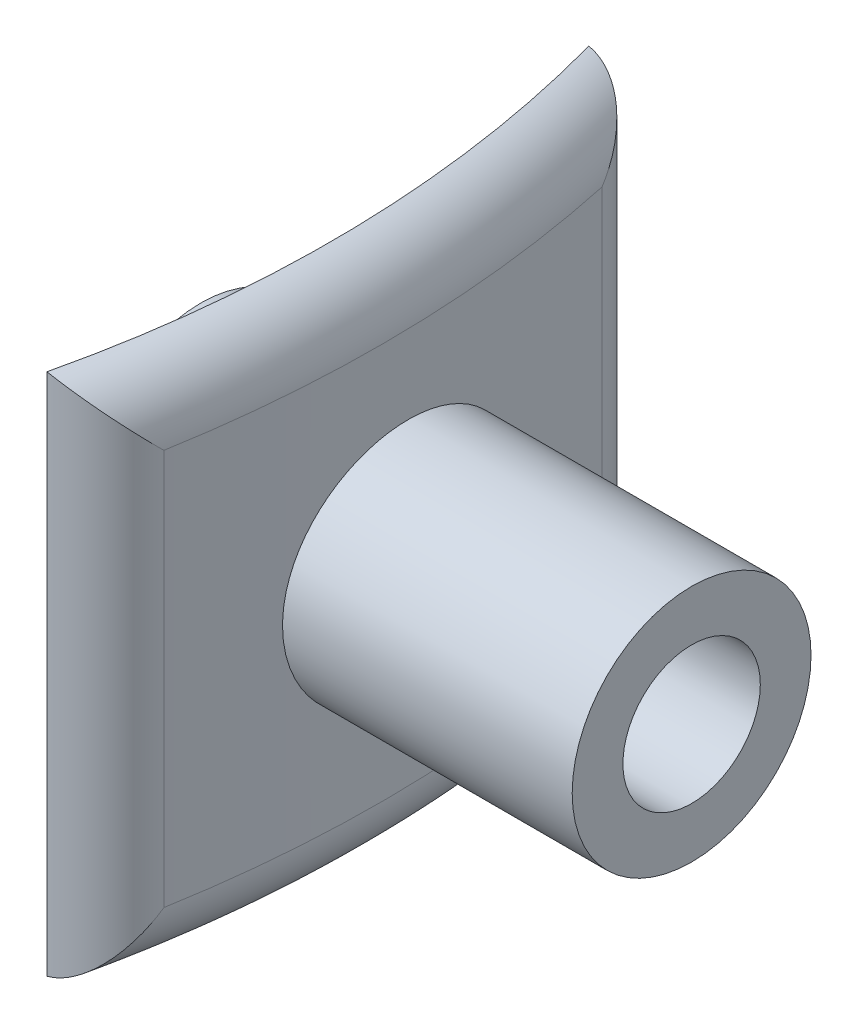
ISO-10303-21;
HEADER;
FILE_DESCRIPTION(('STEP AP214'),'2;1');
FILE_NAME('part.step','',(''),(''),'','','');
FILE_SCHEMA(('AUTOMOTIVE_DESIGN { 1 0 10303 214 1 1 1 1 }'));
ENDSEC;
DATA;
#1=APPLICATION_CONTEXT('core data for automotive mechanical design processes');
#2=APPLICATION_PROTOCOL_DEFINITION('international standard','automotive_design',2000,#1);
#3=PRODUCT_CONTEXT('',#1,'mechanical');
#4=PRODUCT('Part','Part','',(#3));
#5=PRODUCT_RELATED_PRODUCT_CATEGORY('part','',(#4));
#6=PRODUCT_DEFINITION_FORMATION('','',#4);
#7=PRODUCT_DEFINITION_CONTEXT('part definition',#1,'design');
#8=PRODUCT_DEFINITION('design','',#6,#7);
#9=PRODUCT_DEFINITION_SHAPE('','',#8);
#10=(LENGTH_UNIT() NAMED_UNIT(*) SI_UNIT(.MILLI.,.METRE.));
#11=(NAMED_UNIT(*) PLANE_ANGLE_UNIT() SI_UNIT($,.RADIAN.));
#12=(NAMED_UNIT(*) SI_UNIT($,.STERADIAN.) SOLID_ANGLE_UNIT());
#13=UNCERTAINTY_MEASURE_WITH_UNIT(LENGTH_MEASURE(1.E-05),#10,'distance_accuracy_value','');
#14=(GEOMETRIC_REPRESENTATION_CONTEXT(3) GLOBAL_UNCERTAINTY_ASSIGNED_CONTEXT((#13)) GLOBAL_UNIT_ASSIGNED_CONTEXT((#10,
#11,#12)) REPRESENTATION_CONTEXT('',''));
#15=CARTESIAN_POINT('',(0.,0.,0.));
#16=DIRECTION('',(0.,0.,1.));
#17=DIRECTION('',(1.,0.,0.));
#18=AXIS2_PLACEMENT_3D('',#15,#16,#17);
#19=CARTESIAN_POINT('',(15.,0.,0.));
#20=DIRECTION('',(-1.,0.,0.));
#21=DIRECTION('',(0.,0.,1.));
#22=AXIS2_PLACEMENT_3D('',#19,#20,#21);
#23=CYLINDRICAL_SURFACE('',#22,3.65);
#24=CARTESIAN_POINT('',(0.,0.,0.));
#25=DIRECTION('',(1.,0.,0.));
#26=DIRECTION('',(0.,0.,-1.));
#27=AXIS2_PLACEMENT_3D('',#24,#25,#26);
#28=CIRCLE('',#27,3.65);
#29=CARTESIAN_POINT('',(0.,0.,-3.65));
#30=VERTEX_POINT('',#29);
#31=EDGE_CURVE('E161',#30,#30,#28,.T.);
#32=ORIENTED_EDGE('',*,*,#31,.T.);
#33=EDGE_LOOP('',(#32));
#34=FACE_BOUND('',#33,.T.);
#35=CARTESIAN_POINT('',(4.59120938322113,0.,3.65));
#36=CARTESIAN_POINT('',(4.59121172629048,-0.204664380028481,3.64999123078396));
#37=CARTESIAN_POINT('',(4.5926946806854,-0.409462104009955,3.63272860399176));
#38=CARTESIAN_POINT('',(4.59843485429364,-0.813382434525636,3.56412149706426));
#39=CARTESIAN_POINT('',(4.60269508906102,-1.01249862651295,3.51273996970616));
#40=CARTESIAN_POINT('',(4.61340902352784,-1.39915643436182,3.37739209715057));
#41=CARTESIAN_POINT('',(4.61986149177989,-1.58670447868848,3.29344404186284));
#42=CARTESIAN_POINT('',(4.63407833708024,-1.94501187111909,3.0953727205034));
#43=CARTESIAN_POINT('',(4.64184245187802,-2.11577456450987,2.98125548388415));
#44=CARTESIAN_POINT('',(4.65762357333344,-2.43616980114959,2.72574046192228));
#45=CARTESIAN_POINT('',(4.66564114732939,-2.58575012678884,2.5842772254321));
#46=CARTESIAN_POINT('',(4.68075193080286,-2.85907481830356,2.2782202108013));
#47=CARTESIAN_POINT('',(4.68784510711642,-2.98281825734362,2.1136256032333));
#48=CARTESIAN_POINT('',(4.70001266801859,-3.20101470616913,1.76583439696652));
#49=CARTESIAN_POINT('',(4.70508580794946,-3.2954496494678,1.58262641650373));
#50=CARTESIAN_POINT('',(4.71229938291332,-3.45220556214434,1.20289851524057));
#51=CARTESIAN_POINT('',(4.71443990637158,-3.5145274997693,1.00637899600182));
#52=CARTESIAN_POINT('',(4.71518524814789,-3.60508014639456,0.606440773291657));
#53=CARTESIAN_POINT('',(4.71380388848524,-3.63344348709828,0.40305212230182));
#54=CARTESIAN_POINT('',(4.70732044111687,-3.65572551651576,-0.0055408183184171));
#55=CARTESIAN_POINT('',(4.70221842456607,-3.64964486393146,-0.210745073152542));
#56=CARTESIAN_POINT('',(4.6885100656863,-3.60331405803135,-0.616652708301793));
#57=CARTESIAN_POINT('',(4.67991184105896,-3.56314282493557,-0.817365386098598));
#58=CARTESIAN_POINT('',(4.65980671754418,-3.44993511441104,-1.20914338931598));
#59=CARTESIAN_POINT('',(4.64829973968489,-3.37689774463372,-1.40020845263748));
#60=CARTESIAN_POINT('',(4.62325810221284,-3.19970549882439,-1.7681176739334));
#61=CARTESIAN_POINT('',(4.60971552845204,-3.09542751802431,-1.94490199267523));
#62=CARTESIAN_POINT('',(4.5818233749475,-2.85880485889646,-2.27849910145298));
#63=CARTESIAN_POINT('',(4.56747376429497,-2.72645910505952,-2.43531112581603));
#64=CARTESIAN_POINT('',(4.53920512197293,-2.4365950450517,-2.72539357663352));
#65=CARTESIAN_POINT('',(4.52528881869855,-2.27894528173508,-2.85853295972748));
#66=CARTESIAN_POINT('',(4.49929771877884,-1.94339164390809,-3.09645410040767));
#67=CARTESIAN_POINT('',(4.48722290875944,-1.76548791651097,-3.20123606394735));
#68=CARTESIAN_POINT('',(4.46611464212508,-1.39469527216041,-3.37928384768045));
#69=CARTESIAN_POINT('',(4.45707683602681,-1.20182827686854,-3.45259478165134));
#70=CARTESIAN_POINT('',(4.44292329907215,-0.806378047585215,-3.56574600224665));
#71=CARTESIAN_POINT('',(4.43780737097099,-0.603795302776908,-3.60558797215041));
#72=CARTESIAN_POINT('',(4.43203736195369,-0.196237655974126,-3.65044051904934));
#73=CARTESIAN_POINT('',(4.43135119813201,0.00870925047162435,-3.65570155614416));
#74=CARTESIAN_POINT('',(4.43442422376938,0.416562474339463,-3.63190051587832));
#75=CARTESIAN_POINT('',(4.43818331553003,0.619468836510047,-3.60283919285885));
#76=CARTESIAN_POINT('',(4.44975023311266,1.01681306795526,-3.51141283703367));
#77=CARTESIAN_POINT('',(4.45754492153211,1.21127621006062,-3.44915584921803));
#78=CARTESIAN_POINT('',(4.47640751990414,1.586996531997,-3.29322278604816));
#79=CARTESIAN_POINT('',(4.48747553613304,1.76825328281314,-3.19954569055263));
#80=CARTESIAN_POINT('',(4.51188066560152,2.11347054513811,-2.98286656360472));
#81=CARTESIAN_POINT('',(4.52522946480916,2.27733455710994,-2.85971212775771));
#82=CARTESIAN_POINT('',(4.55288536751527,2.58214548453924,-2.58780599751019));
#83=CARTESIAN_POINT('',(4.56719251156143,2.72309142946436,-2.43905321962206));
#84=CARTESIAN_POINT('',(4.59553525278712,2.97900005357171,-2.11903348802856));
#85=CARTESIAN_POINT('',(4.60956848813616,3.09378835493904,-1.94762682360452));
#86=CARTESIAN_POINT('',(4.63600299303269,3.29294703787098,-1.58785207213984));
#87=CARTESIAN_POINT('',(4.64840427220547,3.3773175988447,-1.39948408514822));
#88=CARTESIAN_POINT('',(4.67051402493837,3.51313841685286,-1.01124524967025));
#89=CARTESIAN_POINT('',(4.6802246326249,3.56461480672504,-0.81138367023917));
#90=CARTESIAN_POINT('',(4.69623438772658,3.63320893317534,-0.405716740416642));
#91=CARTESIAN_POINT('',(4.70253366115882,3.65032793900269,-0.199911609880038));
#92=CARTESIAN_POINT('',(4.71135807936394,3.64966447726444,0.210503328504181));
#93=CARTESIAN_POINT('',(4.7139053129971,3.6320877149395,0.41511301106181));
#94=CARTESIAN_POINT('',(4.71538185085023,3.5629223545254,0.818511769949876));
#95=CARTESIAN_POINT('',(4.71431119907785,3.51133417015444,1.01730091705115));
#96=CARTESIAN_POINT('',(4.70903979486041,3.37578405633285,1.40294757181104));
#97=CARTESIAN_POINT('',(4.70484630747234,3.29189748522415,1.58983168199341));
#98=CARTESIAN_POINT('',(4.69414344481571,3.09413631055805,1.94691433081452));
#99=CARTESIAN_POINT('',(4.68763409514057,2.98026203840917,2.11711305382298));
#100=CARTESIAN_POINT('',(4.67330622621298,2.72529975171006,2.43662883169474));
#101=CARTESIAN_POINT('',(4.6654833027046,2.58411993470346,2.58587242768518));
#102=CARTESIAN_POINT('',(4.64968879071726,2.27872673947672,2.85864061053118));
#103=CARTESIAN_POINT('',(4.64171716690657,2.11450782505275,2.98215899794423));
#104=CARTESIAN_POINT('',(4.62671992365287,1.76708067780975,3.20033817619805));
#105=CARTESIAN_POINT('',(4.61969768561444,1.58380847977612,3.29489726129375));
#106=CARTESIAN_POINT('',(4.60761041356423,1.20405491581571,3.45179213684502));
#107=CARTESIAN_POINT('',(4.60254322657721,1.00758836166003,3.51416339944199));
#108=CARTESIAN_POINT('',(4.59631408781219,0.675041302907358,3.58960707035691));
#109=CARTESIAN_POINT('',(4.59441062602691,0.541062092954273,3.61222344730068));
#110=CARTESIAN_POINT('',(4.59185749869404,0.271408134935148,3.6424227969206));
#111=CARTESIAN_POINT('',(4.59120782929782,0.135733392074987,3.65000581574302));
#112=CARTESIAN_POINT('',(4.59120938322113,0.,3.65));
#113=B_SPLINE_CURVE_WITH_KNOTS('',3,(#35,#36,#37,#38,#39,#40,#41,#42,#43,#44,#45,#46,#47,#48,
#49,#50,#51,#52,#53,#54,#55,#56,#57,#58,#59,#60,#61,#62,#63,#64,#65,#66,#67,#68,#69,#70,#71,#72,
#73,#74,#75,#76,#77,#78,#79,#80,#81,#82,#83,#84,#85,#86,#87,#88,#89,#90,#91,#92,#93,#94,#95,#96,
#97,#98,#99,#100,#101,#102,#103,#104,#105,#106,#107,#108,#109,#110,#111,#112),.UNSPECIFIED.,.T.,
.F.,(4,2,2,2,2,2,2,2,2,2,2,2,2,2,2,2,2,2,2,2,2,2,2,2,2,2,2,2,2,2,2,2,2,2,2,2,2,2,4),(0.,
0.6134981531781,1.22766355088713,1.84148452116802,2.45518290906428,3.07036875546838,
3.68557666637667,4.30116305698177,4.91673088580478,5.52988657261133,6.14303053355713,
6.75475891679047,7.36650391006527,7.98069194323136,8.59490351528817,9.21241591149892,
9.82992382273763,10.4465435551036,11.0631322735007,11.6752502431684,12.2873547598802,
12.8974790571522,13.5076231657264,14.1209927176272,14.7343882376882,15.3517604989498,
15.969129118783,16.5860066571413,17.2028614060536,17.8160699128898,18.4292709607365,
19.0410498788135,19.6528220361113,20.2666879208997,20.8807015686897,21.4968475508839,
22.1123130601382,22.5191862100421,22.92605811101),.UNSPECIFIED.);
#114=CARTESIAN_POINT('',(4.59120938322113,0.,3.65));
#115=VERTEX_POINT('',#114);
#116=EDGE_CURVE('E128',#115,#115,#113,.T.);
#117=ORIENTED_EDGE('',*,*,#116,.F.);
#118=EDGE_LOOP('',(#117));
#119=FACE_BOUND('',#118,.T.);
#120=ADVANCED_FACE('F47',(#34,#119),#23,.T.);
#121=CARTESIAN_POINT('',(0.,0.,0.));
#122=DIRECTION('',(1.,0.,0.));
#123=DIRECTION('',(0.,0.,-1.));
#124=AXIS2_PLACEMENT_3D('',#121,#122,#123);
#125=PLANE('',#124);
#126=ORIENTED_EDGE('',*,*,#31,.F.);
#127=EDGE_LOOP('',(#126));
#128=FACE_BOUND('',#127,.T.);
#129=CARTESIAN_POINT('',(0.,0.,0.));
#130=DIRECTION('',(1.,0.,0.));
#131=DIRECTION('',(0.,0.,-1.));
#132=AXIS2_PLACEMENT_3D('',#129,#130,#131);
#133=CIRCLE('',#132,2.1);
#134=CARTESIAN_POINT('',(0.,0.,-2.1));
#135=VERTEX_POINT('',#134);
#136=EDGE_CURVE('E127',#135,#135,#133,.T.);
#137=ORIENTED_EDGE('',*,*,#136,.T.);
#138=EDGE_LOOP('',(#137));
#139=FACE_BOUND('',#138,.T.);
#140=ADVANCED_FACE('F144',(#128,#139),#125,.F.);
#141=CARTESIAN_POINT('',(-29.5351271222658,-8.,0.742138807599469));
#142=DIRECTION('',(0.,1.,0.));
#143=DIRECTION('',(0.,0.,1.));
#144=AXIS2_PLACEMENT_3D('',#141,#142,#143);
#145=CYLINDRICAL_SURFACE('',#144,34.25);
#146=DIRECTION('',(0.,1.,0.));
#147=VECTOR('',#146,1.);
#148=CARTESIAN_POINT('',(3.81946698227984,-8.,8.52246991372905));
#149=LINE('',#148,#147);
#150=CARTESIAN_POINT('',(3.81946698227984,-8.,8.52246991372905));
#151=VERTEX_POINT('',#150);
#152=CARTESIAN_POINT('',(3.81946698227984,8.,8.52246991372905));
#153=VERTEX_POINT('',#152);
#154=EDGE_CURVE('E108',#151,#153,#149,.T.);
#155=ORIENTED_EDGE('',*,*,#154,.T.);
#156=CARTESIAN_POINT('',(-29.5351271222658,8.,0.742138807599469));
#157=DIRECTION('',(0.,1.,0.));
#158=DIRECTION('',(0.,0.,1.));
#159=AXIS2_PLACEMENT_3D('',#156,#157,#158);
#160=CIRCLE('',#159,34.25);
#161=CARTESIAN_POINT('',(3.47750715547917,8.,-8.38082551568144));
#162=VERTEX_POINT('',#161);
#163=EDGE_CURVE('E97',#153,#162,#160,.T.);
#164=ORIENTED_EDGE('',*,*,#163,.T.);
#165=DIRECTION('',(0.,1.,0.));
#166=VECTOR('',#165,1.);
#167=CARTESIAN_POINT('',(3.47750715547917,-8.,-8.38082551568144));
#168=LINE('',#167,#166);
#169=CARTESIAN_POINT('',(3.47750715547917,-8.,-8.38082551568144));
#170=VERTEX_POINT('',#169);
#171=EDGE_CURVE('E102',#170,#162,#168,.T.);
#172=ORIENTED_EDGE('',*,*,#171,.F.);
#173=CARTESIAN_POINT('',(-29.5351271222658,-8.,0.742138807599469));
#174=DIRECTION('',(0.,1.,0.));
#175=DIRECTION('',(0.,0.,1.));
#176=AXIS2_PLACEMENT_3D('',#173,#174,#175);
#177=CIRCLE('',#176,34.25);
#178=EDGE_CURVE('E114',#151,#170,#177,.T.);
#179=ORIENTED_EDGE('',*,*,#178,.F.);
#180=EDGE_LOOP('',(#155,#164,#172,#179));
#181=FACE_BOUND('',#180,.T.);
#182=ORIENTED_EDGE('',*,*,#116,.T.);
#183=EDGE_LOOP('',(#182));
#184=FACE_BOUND('',#183,.T.);
#185=ADVANCED_FACE('F110',(#181,#184),#145,.F.);
#186=CARTESIAN_POINT('',(-29.5351271222658,-8.,0.742138807599469));
#187=DIRECTION('',(0.,1.,0.));
#188=DIRECTION('',(0.,0.,1.));
#189=AXIS2_PLACEMENT_3D('',#186,#187,#188);
#190=CYLINDRICAL_SURFACE('',#189,35.8);
#191=DIRECTION('',(0.,1.,0.));
#192=VECTOR('',#191,1.);
#193=CARTESIAN_POINT('',(5.46084710193839,-8.,-6.80251413994131));
#194=LINE('',#193,#192);
#195=CARTESIAN_POINT('',(5.46084710193838,-6.05128247300949,-6.80251413994131));
#196=VERTEX_POINT('',#195);
#197=CARTESIAN_POINT('',(5.46084710193838,6.05128247300949,-6.80251413994131));
#198=VERTEX_POINT('',#197);
#199=EDGE_CURVE('E61',#196,#198,#194,.T.);
#200=ORIENTED_EDGE('',*,*,#199,.T.);
#201=CARTESIAN_POINT('',(-29.5351271222658,6.05128247300949,0.742138807599469));
#202=DIRECTION('',(0.,1.,0.));
#203=DIRECTION('',(0.,0.,1.));
#204=AXIS2_PLACEMENT_3D('',#201,#202,#203);
#205=CIRCLE('',#204,35.8);
#206=CARTESIAN_POINT('',(5.73735065546689,6.05128247300949,6.86523536239528));
#207=VERTEX_POINT('',#206);
#208=EDGE_CURVE('E12',#198,#207,#205,.F.);
#209=ORIENTED_EDGE('',*,*,#208,.T.);
#210=DIRECTION('',(0.,1.,0.));
#211=VECTOR('',#210,1.);
#212=CARTESIAN_POINT('',(5.7373506554669,-8.,6.86523536239528));
#213=LINE('',#212,#211);
#214=CARTESIAN_POINT('',(5.73735065546689,-6.05128247300949,6.86523536239528));
#215=VERTEX_POINT('',#214);
#216=EDGE_CURVE('E173',#207,#215,#213,.F.);
#217=ORIENTED_EDGE('',*,*,#216,.T.);
#218=CARTESIAN_POINT('',(-29.5351271222658,-6.05128247300949,0.742138807599469));
#219=DIRECTION('',(0.,-1.,0.));
#220=DIRECTION('',(0.,0.,-1.));
#221=AXIS2_PLACEMENT_3D('',#218,#219,#220);
#222=CIRCLE('',#221,35.8);
#223=EDGE_CURVE('E72',#215,#196,#222,.F.);
#224=ORIENTED_EDGE('',*,*,#223,.T.);
#225=EDGE_LOOP('',(#200,#209,#217,#224));
#226=FACE_BOUND('',#225,.T.);
#227=CARTESIAN_POINT('',(6.14658168330754,0.,3.65));
#228=CARTESIAN_POINT('',(6.14658393345488,-0.204694711462544,3.64999119865676));
#229=CARTESIAN_POINT('',(6.14800265794003,-0.409524065059438,3.6327234484694));
#230=CARTESIAN_POINT('',(6.15349439275443,-0.813509743745228,3.56409449054305));
#231=CARTESIAN_POINT('',(6.15757031446479,-1.01265959594112,3.51269588588899));
#232=CARTESIAN_POINT('',(6.16782104829782,-1.39938494321323,3.37729984504055));
#233=CARTESIAN_POINT('',(6.17399469694865,-1.5869667863144,3.2933204756112));
#234=CARTESIAN_POINT('',(6.18759736806714,-1.94533438918107,3.09517296214207));
#235=CARTESIAN_POINT('',(6.19502613442816,-2.1161235642643,2.98101097418379));
#236=CARTESIAN_POINT('',(6.21012385071037,-2.43652739445212,2.72542131267409));
#237=CARTESIAN_POINT('',(6.21779329867501,-2.58609404709626,2.58393348491038));
#238=CARTESIAN_POINT('',(6.23224732582161,-2.85938479932295,2.27783164035854));
#239=CARTESIAN_POINT('',(6.23903187302408,-2.98310796504284,2.11321678822738));
#240=CARTESIAN_POINT('',(6.25066864371231,-3.20125201944807,1.7654030170177));
#241=CARTESIAN_POINT('',(6.25551978182472,-3.29565644269014,1.58219373163013));
#242=CARTESIAN_POINT('',(6.26241625151627,-3.45235283968135,1.20247334455103));
#243=CARTESIAN_POINT('',(6.26446166096518,-3.51464570461972,1.00596261218464));
#244=CARTESIAN_POINT('',(6.26517028105413,-3.60516024440392,0.605981489782361));
#245=CARTESIAN_POINT('',(6.26384560230167,-3.63350338081564,0.402538604829344));
#246=CARTESIAN_POINT('',(6.2576347877727,-3.6557274994668,-0.00616356276353039));
#247=CARTESIAN_POINT('',(6.25274871499512,-3.64960909129754,-0.211422813209517));
#248=CARTESIAN_POINT('',(6.23962129749906,-3.6031778350176,-0.617481270203269));
#249=CARTESIAN_POINT('',(6.23138706388588,-3.56293726302622,-0.818288983963507));
#250=CARTESIAN_POINT('',(6.21213448507057,-3.44955406399335,-1.21024876245139));
#251=CARTESIAN_POINT('',(6.20111607008398,-3.37641061221762,-1.40140058501362));
#252=CARTESIAN_POINT('',(6.1771442029526,-3.19899887833573,-1.76940224585326));
#253=CARTESIAN_POINT('',(6.16418381306888,-3.09461760799368,-1.94619715201572));
#254=CARTESIAN_POINT('',(6.13749498789676,-2.85777651885816,-2.27979434807425));
#255=CARTESIAN_POINT('',(6.12376652573574,-2.72531571719086,-2.43659593783225));
#256=CARTESIAN_POINT('',(6.09673326694546,-2.43528585524678,-2.72656127461289));
#257=CARTESIAN_POINT('',(6.08343088424137,-2.27759658914715,-2.85960505520978));
#258=CARTESIAN_POINT('',(6.05859162048138,-1.94199217945567,-3.09732961153821));
#259=CARTESIAN_POINT('',(6.04705472749931,-1.764077172506,-3.20201057886864));
#260=CARTESIAN_POINT('',(6.02689051560808,-1.39327482898718,-3.37986821204974));
#261=CARTESIAN_POINT('',(6.01825934718114,-1.20040772135975,-3.45308659553247));
#262=CARTESIAN_POINT('',(6.0047477079005,-0.804985526806175,-3.56605850345417));
#263=CARTESIAN_POINT('',(5.99986706494879,-0.602430884858948,-3.60581356341167));
#264=CARTESIAN_POINT('',(5.99436843156355,-0.1948228118537,-3.65052079934551));
#265=CARTESIAN_POINT('',(5.99372237696246,0.010205127164606,-3.65570211234386));
#266=CARTESIAN_POINT('',(5.99668305614914,0.41820704097048,-3.63171601853434));
#267=CARTESIAN_POINT('',(6.00028970439881,0.621181056987475,-3.60254930259672));
#268=CARTESIAN_POINT('',(6.01137750419629,1.01870444595113,-3.51087293166092));
#269=CARTESIAN_POINT('',(6.01884720040242,1.21327689439794,-3.44846184200239));
#270=CARTESIAN_POINT('',(6.03691894015747,1.58918804154426,-3.29217538922542));
#271=CARTESIAN_POINT('',(6.04752107713541,1.77052634531741,-3.19829908760588));
#272=CARTESIAN_POINT('',(6.070890170014,2.11578857495093,-2.98122818501273));
#273=CARTESIAN_POINT('',(6.08366736178777,2.27962390673624,-2.85789379288087));
#274=CARTESIAN_POINT('',(6.11013453243985,2.58434058820965,-2.58562064102716));
#275=CARTESIAN_POINT('',(6.12382454667791,2.72522104797273,-2.43668088908477));
#276=CARTESIAN_POINT('',(6.15093166579757,2.9808824930769,-2.11638223503501));
#277=CARTESIAN_POINT('',(6.16434667347012,3.09550391729259,-1.94489574590525));
#278=CARTESIAN_POINT('',(6.18961107416715,3.29431855478515,-1.58500067967902));
#279=CARTESIAN_POINT('',(6.20146047596857,3.37851193864938,-1.39659219745898));
#280=CARTESIAN_POINT('',(6.2225809011869,3.51398118910864,-1.00830665902768));
#281=CARTESIAN_POINT('',(6.23185383407643,3.56528147051208,-0.808438229257342));
#282=CARTESIAN_POINT('',(6.24713509229635,3.63353119177433,-0.402799259242581));
#283=CARTESIAN_POINT('',(6.25314352739168,3.65048178665357,-0.197028917688005));
#284=CARTESIAN_POINT('',(6.26155321763611,3.64949997341637,0.213385208363849));
#285=CARTESIAN_POINT('',(6.2639738237182,3.63175590324942,0.418029061316485));
#286=CARTESIAN_POINT('',(6.2653535005255,3.56224544731467,0.821464612771621));
#287=CARTESIAN_POINT('',(6.26431260898176,3.51047943239823,1.02025637503933));
#288=CARTESIAN_POINT('',(6.2592375434602,3.37455300654808,1.40591931749202));
#289=CARTESIAN_POINT('',(6.25520968520958,3.29046112676658,1.59281474756753));
#290=CARTESIAN_POINT('',(6.24494137752885,3.09227407234796,1.949880748516));
#291=CARTESIAN_POINT('',(6.23870095756451,2.97817929727908,2.12005154208046));
#292=CARTESIAN_POINT('',(6.22497508230945,2.72280467986642,2.4394201503292));
#293=CARTESIAN_POINT('',(6.2174857861386,2.58144075505131,2.58855056003759));
#294=CARTESIAN_POINT('',(6.20237225062109,2.27569536647623,2.86105756319308));
#295=CARTESIAN_POINT('',(6.19474797915515,2.11130835794337,2.98442793483075));
#296=CARTESIAN_POINT('',(6.18041368867406,1.7636170987647,3.20224752446073));
#297=CARTESIAN_POINT('',(6.17370668146063,1.58025384563258,3.29660268090727));
#298=CARTESIAN_POINT('',(6.16217000300821,1.20036043235812,3.45307763643991));
#299=CARTESIAN_POINT('',(6.15733825093364,1.00384515171586,3.51523319090394));
#300=CARTESIAN_POINT('',(6.1514180675114,0.671866703921065,3.59017837151665));
#301=CARTESIAN_POINT('',(6.14961457068539,0.538507394697562,3.61258103971686));
#302=CARTESIAN_POINT('',(6.14719563771347,0.270118267733158,3.6424947378377));
#303=CARTESIAN_POINT('',(6.14658019832083,0.135088454558438,3.6500058084542));
#304=CARTESIAN_POINT('',(6.14658168330754,0.,3.65));
#305=B_SPLINE_CURVE_WITH_KNOTS('',3,(#227,#228,#229,#230,#231,#232,#233,#234,#235,#236,#237,
#238,#239,#240,#241,#242,#243,#244,#245,#246,#247,#248,#249,#250,#251,#252,#253,#254,#255,#256,
#257,#258,#259,#260,#261,#262,#263,#264,#265,#266,#267,#268,#269,#270,#271,#272,#273,#274,#275,
#276,#277,#278,#279,#280,#281,#282,#283,#284,#285,#286,#287,#288,#289,#290,#291,#292,#293,#294,
#295,#296,#297,#298,#299,#300,#301,#302,#303,#304),.UNSPECIFIED.,.T.,.F.,(4,2,2,2,2,2,2,2,2,2,2,
2,2,2,2,2,2,2,2,2,2,2,2,2,2,2,2,2,2,2,2,2,2,2,2,2,2,2,4),(0.,0.613591466673307,1.22785635258512,
1.84178110057926,2.45558072824781,3.07074728126786,3.68593605968361,4.30146970674346,
4.91698627003276,5.53029406556813,6.14359101231742,6.75559213519472,7.3676085991731,
7.98186606694113,8.59614503924562,9.2134431570177,9.8307371046611,10.4472100102104,
11.0636546263644,11.6760096714532,12.2883523999499,12.8988896337458,13.5094450794282,
14.1229575412055,14.7364937822592,15.353664696221,15.9708321501113,16.5875409813575,
17.2042290752058,17.8175788068494,18.4309218528721,19.042971713448,19.6550134233669,
20.2689733900284,20.8830814750462,21.4991598843411,22.1145527078374,22.5194940416505,
22.9244342688352),.UNSPECIFIED.);
#306=CARTESIAN_POINT('',(6.14658168330754,0.,3.65));
#307=VERTEX_POINT('',#306);
#308=EDGE_CURVE('E107',#307,#307,#305,.T.);
#309=ORIENTED_EDGE('',*,*,#308,.F.);
#310=EDGE_LOOP('',(#309));
#311=FACE_BOUND('',#310,.T.);
#312=ADVANCED_FACE('F138',(#226,#311),#190,.T.);
#313=ORIENTED_EDGE('',*,*,#308,.T.);
#314=EDGE_LOOP('',(#313));
#315=FACE_BOUND('',#314,.T.);
#316=CARTESIAN_POINT('',(15.,0.,0.));
#317=DIRECTION('',(1.,0.,0.));
#318=DIRECTION('',(0.,0.,-1.));
#319=AXIS2_PLACEMENT_3D('',#316,#317,#318);
#320=CIRCLE('',#319,3.65);
#321=CARTESIAN_POINT('',(15.,0.,-3.65));
#322=VERTEX_POINT('',#321);
#323=EDGE_CURVE('E169',#322,#322,#320,.T.);
#324=ORIENTED_EDGE('',*,*,#323,.F.);
#325=EDGE_LOOP('',(#324));
#326=FACE_BOUND('',#325,.T.);
#327=ADVANCED_FACE('F134',(#315,#326),#23,.T.);
#328=CARTESIAN_POINT('',(15.,0.,0.));
#329=DIRECTION('',(1.,0.,0.));
#330=DIRECTION('',(0.,0.,-1.));
#331=AXIS2_PLACEMENT_3D('',#328,#329,#330);
#332=PLANE('',#331);
#333=ORIENTED_EDGE('',*,*,#323,.T.);
#334=EDGE_LOOP('',(#333));
#335=FACE_BOUND('',#334,.T.);
#336=CARTESIAN_POINT('',(15.,0.,0.));
#337=DIRECTION('',(1.,0.,0.));
#338=DIRECTION('',(0.,0.,-1.));
#339=AXIS2_PLACEMENT_3D('',#336,#337,#338);
#340=CIRCLE('',#339,2.1);
#341=CARTESIAN_POINT('',(15.,0.,-2.1));
#342=VERTEX_POINT('',#341);
#343=EDGE_CURVE('E165',#342,#342,#340,.T.);
#344=ORIENTED_EDGE('',*,*,#343,.F.);
#345=EDGE_LOOP('',(#344));
#346=FACE_BOUND('',#345,.T.);
#347=ADVANCED_FACE('F148',(#335,#346),#332,.T.);
#348=CARTESIAN_POINT('',(15.,0.,0.));
#349=DIRECTION('',(-1.,0.,0.));
#350=DIRECTION('',(0.,0.,1.));
#351=AXIS2_PLACEMENT_3D('',#348,#349,#350);
#352=CYLINDRICAL_SURFACE('',#351,2.1);
#353=ORIENTED_EDGE('',*,*,#343,.T.);
#354=EDGE_LOOP('',(#353));
#355=FACE_BOUND('',#354,.T.);
#356=ORIENTED_EDGE('',*,*,#136,.F.);
#357=EDGE_LOOP('',(#356));
#358=FACE_BOUND('',#357,.T.);
#359=ADVANCED_FACE('F145',(#355,#358),#352,.F.);
#360=CARTESIAN_POINT('',(-29.5351271222658,-6.05128247300949,0.742138807599469));
#361=DIRECTION('',(0.,-1.,0.));
#362=DIRECTION('',(0.,0.,-1.));
#363=AXIS2_PLACEMENT_3D('',#360,#361,#362);
#364=TOROIDAL_SURFACE('',#363,33.8,2.);
#365=CARTESIAN_POINT('',(3.47750715547917,-8.,-8.38082551568144));
#366=CARTESIAN_POINT('',(3.52961823488851,-7.98836011090352,-8.38156699166574));
#367=CARTESIAN_POINT('',(3.58128700818878,-7.97487243865995,-8.38025433790259));
#368=CARTESIAN_POINT('',(3.68330740869494,-7.94457136109449,-8.37378270267723));
#369=CARTESIAN_POINT('',(3.73366104642785,-7.92776341506891,-8.36862999709181));
#370=CARTESIAN_POINT('',(3.88130966031582,-7.87323176663703,-8.34794296332676));
#371=CARTESIAN_POINT('',(3.97630470140095,-7.83113968956427,-8.32718362206051));
#372=CARTESIAN_POINT('',(4.15753249486558,-7.73833950587938,-8.27419283973812));
#373=CARTESIAN_POINT('',(4.24381646675894,-7.68768709403993,-8.24203416731908));
#374=CARTESIAN_POINT('',(4.40795688405582,-7.5796007093843,-8.16824859497671));
#375=CARTESIAN_POINT('',(4.48578663370455,-7.52214638732408,-8.12659292030569));
#376=CARTESIAN_POINT('',(4.67489440910318,-7.36771596175327,-8.00942118326911));
#377=CARTESIAN_POINT('',(4.77963482390622,-7.26702863386903,-7.92821731276751));
#378=CARTESIAN_POINT('',(4.96761721935176,-7.05792751539662,-7.7520211570454));
#379=CARTESIAN_POINT('',(5.05081547493848,-6.94949857133133,-7.65700142988612));
#380=CARTESIAN_POINT('',(5.20663281274214,-6.71227809340753,-7.44263791257621));
#381=CARTESIAN_POINT('',(5.27605297742087,-6.5827872725292,-7.32175759408028));
#382=CARTESIAN_POINT('',(5.3879210676883,-6.32136770597164,-7.07113572213844));
#383=CARTESIAN_POINT('',(5.43043304588443,-6.18944552493237,-6.94141603238381));
#384=CARTESIAN_POINT('',(5.45991602302705,-6.05555894651157,-6.80681570640584));
#385=CARTESIAN_POINT('',(5.46038334086982,-6.0534206835568,-6.80466527895887));
#386=CARTESIAN_POINT('',(5.46084710193838,-6.05128247300949,-6.8025141399413));
#387=B_SPLINE_CURVE_WITH_KNOTS('',3,(#365,#366,#367,#368,#369,#370,#371,#372,#373,#374,#375,
#376,#377,#378,#379,#380,#381,#382,#383,#384,#385,#386),.UNSPECIFIED.,.F.,.F.,(4,2,2,2,2,2,2,2,
2,2,4),(0.,0.160033383022211,0.319805792141466,0.635978419669323,0.950168039518428,
1.26532257333563,1.7619038926736,2.25948538029074,2.82800038773519,3.39515695393989,
3.40436205288209),.UNSPECIFIED.);
#388=EDGE_CURVE('E104',#196,#170,#387,.F.);
#389=ORIENTED_EDGE('',*,*,#388,.F.);
#390=ORIENTED_EDGE('',*,*,#223,.F.);
#391=CARTESIAN_POINT('',(3.81946698227984,-8.,8.52246991372905));
#392=CARTESIAN_POINT('',(3.8715654127672,-7.98836011090352,8.52110319334981));
#393=CARTESIAN_POINT('',(3.92313882145471,-7.97487243865996,8.51770191261928));
#394=CARTESIAN_POINT('',(4.02481400886893,-7.9445713610945,8.50710944141514));
#395=CARTESIAN_POINT('',(4.07491805030031,-7.92776341506892,8.49992444036927));
#396=CARTESIAN_POINT('',(4.22160918798663,-7.87323176663704,8.47328280616024));
#397=CARTESIAN_POINT('',(4.31568690962859,-7.83113968956428,8.44869845399804));
#398=CARTESIAN_POINT('',(4.49462325388776,-7.7383395058794,8.38842141991071));
#399=CARTESIAN_POINT('',(4.5795359971786,-7.68768709403994,8.35279937555228));
#400=CARTESIAN_POINT('',(4.74055791801293,-7.57960070938431,8.27243565060686));
#401=CARTESIAN_POINT('',(4.81663925787314,-7.52214638732408,8.22766629850348));
#402=CARTESIAN_POINT('',(5.00085339080835,-7.36771596175332,8.10294212320725));
#403=CARTESIAN_POINT('',(5.10222388329704,-7.26702863386919,8.01756855393565));
#404=CARTESIAN_POINT('',(5.28292636306482,-7.0579275153965,7.83391376882415));
#405=CARTESIAN_POINT('',(5.36221355119737,-6.94949857133082,7.73560690192235));
#406=CARTESIAN_POINT('',(5.50923364328303,-6.71227809340814,7.51511687303814));
#407=CARTESIAN_POINT('',(5.57370810343026,-6.58278727253161,7.39152781748348));
#408=CARTESIAN_POINT('',(5.67534846798148,-6.32136770596926,7.13658659169386));
#409=CARTESIAN_POINT('',(5.71257925684403,-6.18944552492342,7.00525367670633));
#410=CARTESIAN_POINT('',(5.73659431167753,-6.05555894651128,6.8695710660363));
#411=CARTESIAN_POINT('',(5.73697427489368,-6.05342068355666,6.86740349778459));
#412=CARTESIAN_POINT('',(5.73735065546689,-6.05128247300949,6.86523536239528));
#413=B_SPLINE_CURVE_WITH_KNOTS('',3,(#391,#392,#393,#394,#395,#396,#397,#398,#399,#400,#401,
#402,#403,#404,#405,#406,#407,#408,#409,#410,#411,#412),.UNSPECIFIED.,.F.,.F.,(4,2,2,2,2,2,2,2,
2,2,4),(0.,0.160033383022204,0.319805792141455,0.635978419669325,0.950168039518439,
1.26532257333563,1.76190389267358,2.25948538029074,2.82800038773521,3.39515695393991,
3.40436205288212),.UNSPECIFIED.);
#414=EDGE_CURVE('E52',#151,#215,#413,.T.);
#415=ORIENTED_EDGE('',*,*,#414,.F.);
#416=ORIENTED_EDGE('',*,*,#178,.T.);
#417=EDGE_LOOP('',(#389,#390,#415,#416));
#418=FACE_BOUND('',#417,.T.);
#419=ADVANCED_FACE('F49',(#418),#364,.T.);
#420=CARTESIAN_POINT('',(3.76682117067735,-8.,6.52316292916646));
#421=DIRECTION('',(0.,-1.,0.));
#422=DIRECTION('',(0.,0.,-1.));
#423=AXIS2_PLACEMENT_3D('',#420,#421,#422);
#424=CYLINDRICAL_SURFACE('',#423,2.);
#425=ORIENTED_EDGE('',*,*,#414,.T.);
#426=ORIENTED_EDGE('',*,*,#216,.F.);
#427=CARTESIAN_POINT('',(3.81946698227984,8.,8.52246991372905));
#428=CARTESIAN_POINT('',(3.8715654127672,7.98836011090352,8.52110319334981));
#429=CARTESIAN_POINT('',(3.92313882145471,7.97487243865996,8.51770191261928));
#430=CARTESIAN_POINT('',(4.02481400886893,7.9445713610945,8.50710944141514));
#431=CARTESIAN_POINT('',(4.07491805030031,7.92776341506892,8.49992444036927));
#432=CARTESIAN_POINT('',(4.22160918798663,7.87323176663704,8.47328280616024));
#433=CARTESIAN_POINT('',(4.31568690962859,7.83113968956428,8.44869845399804));
#434=CARTESIAN_POINT('',(4.49462325388776,7.7383395058794,8.38842141991071));
#435=CARTESIAN_POINT('',(4.5795359971786,7.68768709403994,8.35279937555228));
#436=CARTESIAN_POINT('',(4.74055791801293,7.57960070938431,8.27243565060686));
#437=CARTESIAN_POINT('',(4.81663925787314,7.52214638732408,8.22766629850348));
#438=CARTESIAN_POINT('',(5.00085339080835,7.36771596175332,8.10294212320725));
#439=CARTESIAN_POINT('',(5.10222388329704,7.26702863386919,8.01756855393565));
#440=CARTESIAN_POINT('',(5.28292636306482,7.0579275153965,7.83391376882415));
#441=CARTESIAN_POINT('',(5.36221355119737,6.94949857133082,7.73560690192235));
#442=CARTESIAN_POINT('',(5.50923364328303,6.71227809340814,7.51511687303814));
#443=CARTESIAN_POINT('',(5.57370810343026,6.58278727253161,7.39152781748348));
#444=CARTESIAN_POINT('',(5.67534846798148,6.32136770596926,7.13658659169386));
#445=CARTESIAN_POINT('',(5.71257925684403,6.18944552492342,7.00525367670633));
#446=CARTESIAN_POINT('',(5.73659431167753,6.05555894651128,6.8695710660363));
#447=CARTESIAN_POINT('',(5.73697427489368,6.05342068355666,6.86740349778459));
#448=CARTESIAN_POINT('',(5.73735065546689,6.05128247300949,6.86523536239528));
#449=B_SPLINE_CURVE_WITH_KNOTS('',3,(#427,#428,#429,#430,#431,#432,#433,#434,#435,#436,#437,
#438,#439,#440,#441,#442,#443,#444,#445,#446,#447,#448),.UNSPECIFIED.,.F.,.F.,(4,2,2,2,2,2,2,2,
2,2,4),(0.,0.160033383022204,0.319805792141455,0.635978419669325,0.950168039518439,
1.26532257333563,1.76190389267358,2.25948538029074,2.82800038773521,3.39515695393991,
3.40436205288212),.UNSPECIFIED.);
#450=EDGE_CURVE('E99',#153,#207,#449,.T.);
#451=ORIENTED_EDGE('',*,*,#450,.F.);
#452=ORIENTED_EDGE('',*,*,#154,.F.);
#453=EDGE_LOOP('',(#425,#426,#451,#452));
#454=FACE_BOUND('',#453,.T.);
#455=ADVANCED_FACE('F189',(#454),#424,.T.);
#456=CARTESIAN_POINT('',(3.50576474304429,-8.,-6.38102514845858));
#457=DIRECTION('',(0.,-1.,0.));
#458=DIRECTION('',(0.,0.,-1.));
#459=AXIS2_PLACEMENT_3D('',#456,#457,#458);
#460=CYLINDRICAL_SURFACE('',#459,2.);
#461=ORIENTED_EDGE('',*,*,#388,.T.);
#462=ORIENTED_EDGE('',*,*,#171,.T.);
#463=CARTESIAN_POINT('',(3.47750715547917,8.,-8.38082551568144));
#464=CARTESIAN_POINT('',(3.52961823488851,7.98836011090352,-8.38156699166574));
#465=CARTESIAN_POINT('',(3.58128700818878,7.97487243865995,-8.38025433790259));
#466=CARTESIAN_POINT('',(3.68330740869494,7.94457136109449,-8.37378270267723));
#467=CARTESIAN_POINT('',(3.73366104642785,7.92776341506891,-8.36862999709181));
#468=CARTESIAN_POINT('',(3.88130966031582,7.87323176663703,-8.34794296332676));
#469=CARTESIAN_POINT('',(3.97630470140095,7.83113968956427,-8.32718362206051));
#470=CARTESIAN_POINT('',(4.15753249486558,7.73833950587938,-8.27419283973812));
#471=CARTESIAN_POINT('',(4.24381646675894,7.68768709403993,-8.24203416731908));
#472=CARTESIAN_POINT('',(4.40795688405582,7.5796007093843,-8.16824859497671));
#473=CARTESIAN_POINT('',(4.48578663370455,7.52214638732408,-8.12659292030569));
#474=CARTESIAN_POINT('',(4.67489440910318,7.36771596175327,-8.00942118326911));
#475=CARTESIAN_POINT('',(4.77963482390622,7.26702863386903,-7.92821731276751));
#476=CARTESIAN_POINT('',(4.96761721935176,7.05792751539662,-7.7520211570454));
#477=CARTESIAN_POINT('',(5.05081547493848,6.94949857133133,-7.65700142988612));
#478=CARTESIAN_POINT('',(5.20663281274214,6.71227809340753,-7.44263791257621));
#479=CARTESIAN_POINT('',(5.27605297742087,6.5827872725292,-7.32175759408028));
#480=CARTESIAN_POINT('',(5.3879210676883,6.32136770597164,-7.07113572213844));
#481=CARTESIAN_POINT('',(5.43043304588443,6.18944552493237,-6.94141603238381));
#482=CARTESIAN_POINT('',(5.45991602302705,6.05555894651157,-6.80681570640584));
#483=CARTESIAN_POINT('',(5.46038334086982,6.0534206835568,-6.80466527895887));
#484=CARTESIAN_POINT('',(5.46084710193838,6.05128247300949,-6.8025141399413));
#485=B_SPLINE_CURVE_WITH_KNOTS('',3,(#463,#464,#465,#466,#467,#468,#469,#470,#471,#472,#473,
#474,#475,#476,#477,#478,#479,#480,#481,#482,#483,#484),.UNSPECIFIED.,.F.,.F.,(4,2,2,2,2,2,2,2,
2,2,4),(0.,0.160033383022211,0.319805792141466,0.635978419669323,0.950168039518428,
1.26532257333563,1.7619038926736,2.25948538029074,2.82800038773519,3.39515695393989,
3.40436205288209),.UNSPECIFIED.);
#486=EDGE_CURVE('E93',#198,#162,#485,.F.);
#487=ORIENTED_EDGE('',*,*,#486,.F.);
#488=ORIENTED_EDGE('',*,*,#199,.F.);
#489=EDGE_LOOP('',(#461,#462,#487,#488));
#490=FACE_BOUND('',#489,.T.);
#491=ADVANCED_FACE('F103',(#490),#460,.T.);
#492=CARTESIAN_POINT('',(-29.5351271222658,6.05128247300949,0.742138807599469));
#493=DIRECTION('',(0.,1.,0.));
#494=DIRECTION('',(0.,0.,1.));
#495=AXIS2_PLACEMENT_3D('',#492,#493,#494);
#496=TOROIDAL_SURFACE('',#495,33.8,2.);
#497=ORIENTED_EDGE('',*,*,#450,.T.);
#498=ORIENTED_EDGE('',*,*,#208,.F.);
#499=ORIENTED_EDGE('',*,*,#486,.T.);
#500=ORIENTED_EDGE('',*,*,#163,.F.);
#501=EDGE_LOOP('',(#497,#498,#499,#500));
#502=FACE_BOUND('',#501,.T.);
#503=ADVANCED_FACE('F95',(#502),#496,.T.);
#504=CLOSED_SHELL('',(#120,#140,#185,#312,#327,#347,#359,#419,#455,#491,#503));
#505=MANIFOLD_SOLID_BREP('B2',#504);
#506=ADVANCED_BREP_SHAPE_REPRESENTATION('',(#18,#505),#14);
#507=SHAPE_DEFINITION_REPRESENTATION(#9,#506);
ENDSEC;
END-ISO-10303-21;
